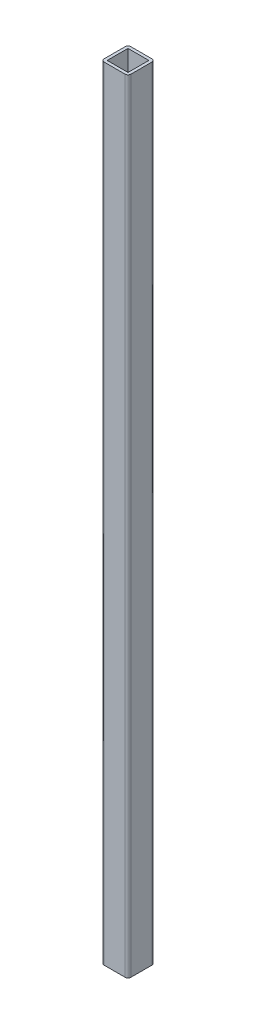
ISO-10303-21;
HEADER;
FILE_DESCRIPTION(('STEP AP214'),'2;1');
FILE_NAME('part.step','',(''),(''),'','','');
FILE_SCHEMA(('AUTOMOTIVE_DESIGN { 1 0 10303 214 1 1 1 1 }'));
ENDSEC;
DATA;
#1=APPLICATION_CONTEXT('core data for automotive mechanical design processes');
#2=APPLICATION_PROTOCOL_DEFINITION('international standard','automotive_design',2000,#1);
#3=PRODUCT_CONTEXT('',#1,'mechanical');
#4=PRODUCT('Part','Part','',(#3));
#5=PRODUCT_RELATED_PRODUCT_CATEGORY('part','',(#4));
#6=PRODUCT_DEFINITION_FORMATION('','',#4);
#7=PRODUCT_DEFINITION_CONTEXT('part definition',#1,'design');
#8=PRODUCT_DEFINITION('design','',#6,#7);
#9=PRODUCT_DEFINITION_SHAPE('','',#8);
#10=(LENGTH_UNIT() NAMED_UNIT(*) SI_UNIT(.MILLI.,.METRE.));
#11=(NAMED_UNIT(*) PLANE_ANGLE_UNIT() SI_UNIT($,.RADIAN.));
#12=(NAMED_UNIT(*) SI_UNIT($,.STERADIAN.) SOLID_ANGLE_UNIT());
#13=UNCERTAINTY_MEASURE_WITH_UNIT(LENGTH_MEASURE(1.E-05),#10,'distance_accuracy_value','');
#14=(GEOMETRIC_REPRESENTATION_CONTEXT(3) GLOBAL_UNCERTAINTY_ASSIGNED_CONTEXT((#13)) GLOBAL_UNIT_ASSIGNED_CONTEXT((#10,
#11,#12)) REPRESENTATION_CONTEXT('',''));
#15=CARTESIAN_POINT('',(0.,0.,0.));
#16=DIRECTION('',(0.,0.,1.));
#17=DIRECTION('',(1.,0.,0.));
#18=AXIS2_PLACEMENT_3D('',#15,#16,#17);
#19=CARTESIAN_POINT('',(22.8,750.2,2.8));
#20=DIRECTION('',(0.,-1.,0.));
#21=DIRECTION('',(0.,0.,-1.));
#22=AXIS2_PLACEMENT_3D('',#19,#20,#21);
#23=CYLINDRICAL_SURFACE('',#22,2.8);
#24=CARTESIAN_POINT('',(22.8,0.,2.8));
#25=DIRECTION('',(0.,1.,0.));
#26=DIRECTION('',(0.,0.,-1.));
#27=AXIS2_PLACEMENT_3D('',#24,#25,#26);
#28=CIRCLE('',#27,2.8);
#29=CARTESIAN_POINT('',(25.6,0.,2.80000000000002));
#30=VERTEX_POINT('',#29);
#31=CARTESIAN_POINT('',(22.8,0.,0.));
#32=VERTEX_POINT('',#31);
#33=EDGE_CURVE('E155',#30,#32,#28,.T.);
#34=ORIENTED_EDGE('',*,*,#33,.T.);
#35=DIRECTION('',(0.,-1.,0.));
#36=VECTOR('',#35,1.);
#37=CARTESIAN_POINT('',(22.8,750.2,0.));
#38=LINE('',#37,#36);
#39=CARTESIAN_POINT('',(22.8,750.2,0.));
#40=VERTEX_POINT('',#39);
#41=EDGE_CURVE('E11',#40,#32,#38,.T.);
#42=ORIENTED_EDGE('',*,*,#41,.F.);
#43=CARTESIAN_POINT('',(22.8,750.2,2.8));
#44=DIRECTION('',(0.,1.,0.));
#45=DIRECTION('',(0.,0.,-1.));
#46=AXIS2_PLACEMENT_3D('',#43,#44,#45);
#47=CIRCLE('',#46,2.8);
#48=CARTESIAN_POINT('',(25.6,750.2,2.80000000000002));
#49=VERTEX_POINT('',#48);
#50=EDGE_CURVE('E159',#49,#40,#47,.T.);
#51=ORIENTED_EDGE('',*,*,#50,.F.);
#52=DIRECTION('',(0.,-1.,0.));
#53=VECTOR('',#52,1.);
#54=CARTESIAN_POINT('',(25.6,750.2,2.80000000000002));
#55=LINE('',#54,#53);
#56=EDGE_CURVE('E177',#49,#30,#55,.T.);
#57=ORIENTED_EDGE('',*,*,#56,.T.);
#58=EDGE_LOOP('',(#34,#42,#51,#57));
#59=FACE_BOUND('',#58,.T.);
#60=ADVANCED_FACE('F34',(#59),#23,.T.);
#61=CARTESIAN_POINT('',(2.80000000000002,750.2,0.));
#62=DIRECTION('',(0.,0.,1.));
#63=DIRECTION('',(1.,0.,0.));
#64=AXIS2_PLACEMENT_3D('',#61,#62,#63);
#65=PLANE('',#64);
#66=DIRECTION('',(-1.,0.,0.));
#67=VECTOR('',#66,1.);
#68=CARTESIAN_POINT('',(2.80000000000002,0.,0.));
#69=LINE('',#68,#67);
#70=CARTESIAN_POINT('',(2.80000000000002,0.,0.));
#71=VERTEX_POINT('',#70);
#72=EDGE_CURVE('E180',#32,#71,#69,.T.);
#73=ORIENTED_EDGE('',*,*,#72,.T.);
#74=DIRECTION('',(0.,-1.,0.));
#75=VECTOR('',#74,1.);
#76=CARTESIAN_POINT('',(2.80000000000002,750.2,0.));
#77=LINE('',#76,#75);
#78=CARTESIAN_POINT('',(2.80000000000002,750.2,0.));
#79=VERTEX_POINT('',#78);
#80=EDGE_CURVE('E41',#79,#71,#77,.T.);
#81=ORIENTED_EDGE('',*,*,#80,.F.);
#82=DIRECTION('',(-1.,0.,0.));
#83=VECTOR('',#82,1.);
#84=CARTESIAN_POINT('',(2.80000000000002,750.2,0.));
#85=LINE('',#84,#83);
#86=EDGE_CURVE('E162',#40,#79,#85,.T.);
#87=ORIENTED_EDGE('',*,*,#86,.F.);
#88=ORIENTED_EDGE('',*,*,#41,.T.);
#89=EDGE_LOOP('',(#73,#81,#87,#88));
#90=FACE_BOUND('',#89,.T.);
#91=ADVANCED_FACE('F235',(#90),#65,.F.);
#92=CARTESIAN_POINT('',(2.8,750.2,2.8));
#93=DIRECTION('',(0.,-1.,0.));
#94=DIRECTION('',(0.,0.,-1.));
#95=AXIS2_PLACEMENT_3D('',#92,#93,#94);
#96=CYLINDRICAL_SURFACE('',#95,2.8);
#97=CARTESIAN_POINT('',(2.8,0.,2.8));
#98=DIRECTION('',(0.,1.,0.));
#99=DIRECTION('',(0.,0.,1.));
#100=AXIS2_PLACEMENT_3D('',#97,#98,#99);
#101=CIRCLE('',#100,2.8);
#102=CARTESIAN_POINT('',(0.,0.,2.80000000000002));
#103=VERTEX_POINT('',#102);
#104=EDGE_CURVE('E182',#71,#103,#101,.T.);
#105=ORIENTED_EDGE('',*,*,#104,.T.);
#106=DIRECTION('',(0.,-1.,0.));
#107=VECTOR('',#106,1.);
#108=CARTESIAN_POINT('',(0.,750.2,2.80000000000002));
#109=LINE('',#108,#107);
#110=CARTESIAN_POINT('',(0.,750.2,2.80000000000002));
#111=VERTEX_POINT('',#110);
#112=EDGE_CURVE('E207',#111,#103,#109,.T.);
#113=ORIENTED_EDGE('',*,*,#112,.F.);
#114=CARTESIAN_POINT('',(2.8,750.2,2.8));
#115=DIRECTION('',(0.,1.,0.));
#116=DIRECTION('',(0.,0.,1.));
#117=AXIS2_PLACEMENT_3D('',#114,#115,#116);
#118=CIRCLE('',#117,2.8);
#119=EDGE_CURVE('E165',#79,#111,#118,.T.);
#120=ORIENTED_EDGE('',*,*,#119,.F.);
#121=ORIENTED_EDGE('',*,*,#80,.T.);
#122=EDGE_LOOP('',(#105,#113,#120,#121));
#123=FACE_BOUND('',#122,.T.);
#124=ADVANCED_FACE('F214',(#123),#96,.T.);
#125=CARTESIAN_POINT('',(0.,750.2,2.80000000000002));
#126=DIRECTION('',(1.,0.,0.));
#127=DIRECTION('',(0.,0.,-1.));
#128=AXIS2_PLACEMENT_3D('',#125,#126,#127);
#129=PLANE('',#128);
#130=DIRECTION('',(0.,0.,1.));
#131=VECTOR('',#130,1.);
#132=CARTESIAN_POINT('',(0.,0.,2.80000000000002));
#133=LINE('',#132,#131);
#134=CARTESIAN_POINT('',(0.,0.,22.8));
#135=VERTEX_POINT('',#134);
#136=EDGE_CURVE('E184',#103,#135,#133,.T.);
#137=ORIENTED_EDGE('',*,*,#136,.T.);
#138=DIRECTION('',(0.,-1.,0.));
#139=VECTOR('',#138,1.);
#140=CARTESIAN_POINT('',(0.,750.2,22.8));
#141=LINE('',#140,#139);
#142=CARTESIAN_POINT('',(0.,750.2,22.8));
#143=VERTEX_POINT('',#142);
#144=EDGE_CURVE('E204',#143,#135,#141,.T.);
#145=ORIENTED_EDGE('',*,*,#144,.F.);
#146=DIRECTION('',(0.,0.,1.));
#147=VECTOR('',#146,1.);
#148=CARTESIAN_POINT('',(0.,750.2,2.80000000000002));
#149=LINE('',#148,#147);
#150=EDGE_CURVE('E167',#111,#143,#149,.T.);
#151=ORIENTED_EDGE('',*,*,#150,.F.);
#152=ORIENTED_EDGE('',*,*,#112,.T.);
#153=EDGE_LOOP('',(#137,#145,#151,#152));
#154=FACE_BOUND('',#153,.T.);
#155=ADVANCED_FACE('F225',(#154),#129,.F.);
#156=CARTESIAN_POINT('',(2.8,750.2,22.8));
#157=DIRECTION('',(0.,-1.,0.));
#158=DIRECTION('',(0.,0.,-1.));
#159=AXIS2_PLACEMENT_3D('',#156,#157,#158);
#160=CYLINDRICAL_SURFACE('',#159,2.8);
#161=CARTESIAN_POINT('',(2.8,0.,22.8));
#162=DIRECTION('',(0.,1.,0.));
#163=DIRECTION('',(0.,0.,1.));
#164=AXIS2_PLACEMENT_3D('',#161,#162,#163);
#165=CIRCLE('',#164,2.8);
#166=CARTESIAN_POINT('',(2.80000000000002,0.,25.6));
#167=VERTEX_POINT('',#166);
#168=EDGE_CURVE('E186',#135,#167,#165,.T.);
#169=ORIENTED_EDGE('',*,*,#168,.T.);
#170=DIRECTION('',(0.,-1.,0.));
#171=VECTOR('',#170,1.);
#172=CARTESIAN_POINT('',(2.80000000000002,750.2,25.6));
#173=LINE('',#172,#171);
#174=CARTESIAN_POINT('',(2.80000000000002,750.2,25.6));
#175=VERTEX_POINT('',#174);
#176=EDGE_CURVE('E201',#175,#167,#173,.T.);
#177=ORIENTED_EDGE('',*,*,#176,.F.);
#178=CARTESIAN_POINT('',(2.8,750.2,22.8));
#179=DIRECTION('',(0.,1.,0.));
#180=DIRECTION('',(0.,0.,1.));
#181=AXIS2_PLACEMENT_3D('',#178,#179,#180);
#182=CIRCLE('',#181,2.8);
#183=EDGE_CURVE('E169',#143,#175,#182,.T.);
#184=ORIENTED_EDGE('',*,*,#183,.F.);
#185=ORIENTED_EDGE('',*,*,#144,.T.);
#186=EDGE_LOOP('',(#169,#177,#184,#185));
#187=FACE_BOUND('',#186,.T.);
#188=ADVANCED_FACE('F229',(#187),#160,.T.);
#189=CARTESIAN_POINT('',(2.80000000000002,750.2,25.6));
#190=DIRECTION('',(0.,0.,-1.));
#191=DIRECTION('',(-1.,0.,0.));
#192=AXIS2_PLACEMENT_3D('',#189,#190,#191);
#193=PLANE('',#192);
#194=DIRECTION('',(1.,0.,0.));
#195=VECTOR('',#194,1.);
#196=CARTESIAN_POINT('',(2.80000000000002,0.,25.6));
#197=LINE('',#196,#195);
#198=CARTESIAN_POINT('',(22.8,0.,25.6));
#199=VERTEX_POINT('',#198);
#200=EDGE_CURVE('E188',#167,#199,#197,.T.);
#201=ORIENTED_EDGE('',*,*,#200,.T.);
#202=DIRECTION('',(0.,-1.,0.));
#203=VECTOR('',#202,1.);
#204=CARTESIAN_POINT('',(22.8,750.2,25.6));
#205=LINE('',#204,#203);
#206=CARTESIAN_POINT('',(22.8,750.2,25.6));
#207=VERTEX_POINT('',#206);
#208=EDGE_CURVE('E198',#207,#199,#205,.T.);
#209=ORIENTED_EDGE('',*,*,#208,.F.);
#210=DIRECTION('',(1.,0.,0.));
#211=VECTOR('',#210,1.);
#212=CARTESIAN_POINT('',(2.80000000000002,750.2,25.6));
#213=LINE('',#212,#211);
#214=EDGE_CURVE('E171',#175,#207,#213,.T.);
#215=ORIENTED_EDGE('',*,*,#214,.F.);
#216=ORIENTED_EDGE('',*,*,#176,.T.);
#217=EDGE_LOOP('',(#201,#209,#215,#216));
#218=FACE_BOUND('',#217,.T.);
#219=ADVANCED_FACE('F248',(#218),#193,.F.);
#220=CARTESIAN_POINT('',(22.8,750.2,22.8));
#221=DIRECTION('',(0.,-1.,0.));
#222=DIRECTION('',(0.,0.,-1.));
#223=AXIS2_PLACEMENT_3D('',#220,#221,#222);
#224=CYLINDRICAL_SURFACE('',#223,2.8);
#225=CARTESIAN_POINT('',(22.8,0.,22.8));
#226=DIRECTION('',(0.,1.,0.));
#227=DIRECTION('',(0.,0.,1.));
#228=AXIS2_PLACEMENT_3D('',#225,#226,#227);
#229=CIRCLE('',#228,2.8);
#230=CARTESIAN_POINT('',(25.6,0.,22.8));
#231=VERTEX_POINT('',#230);
#232=EDGE_CURVE('E190',#199,#231,#229,.T.);
#233=ORIENTED_EDGE('',*,*,#232,.T.);
#234=DIRECTION('',(0.,-1.,0.));
#235=VECTOR('',#234,1.);
#236=CARTESIAN_POINT('',(25.6,750.2,22.8));
#237=LINE('',#236,#235);
#238=CARTESIAN_POINT('',(25.6,750.2,22.8));
#239=VERTEX_POINT('',#238);
#240=EDGE_CURVE('E195',#239,#231,#237,.T.);
#241=ORIENTED_EDGE('',*,*,#240,.F.);
#242=CARTESIAN_POINT('',(22.8,750.2,22.8));
#243=DIRECTION('',(0.,1.,0.));
#244=DIRECTION('',(0.,0.,1.));
#245=AXIS2_PLACEMENT_3D('',#242,#243,#244);
#246=CIRCLE('',#245,2.8);
#247=EDGE_CURVE('E173',#207,#239,#246,.T.);
#248=ORIENTED_EDGE('',*,*,#247,.F.);
#249=ORIENTED_EDGE('',*,*,#208,.T.);
#250=EDGE_LOOP('',(#233,#241,#248,#249));
#251=FACE_BOUND('',#250,.T.);
#252=ADVANCED_FACE('F246',(#251),#224,.T.);
#253=CARTESIAN_POINT('',(25.6,750.2,2.80000000000002));
#254=DIRECTION('',(-1.,0.,0.));
#255=DIRECTION('',(0.,0.,1.));
#256=AXIS2_PLACEMENT_3D('',#253,#254,#255);
#257=PLANE('',#256);
#258=DIRECTION('',(0.,0.,-1.));
#259=VECTOR('',#258,1.);
#260=CARTESIAN_POINT('',(25.6,0.,2.80000000000002));
#261=LINE('',#260,#259);
#262=EDGE_CURVE('E163',#231,#30,#261,.T.);
#263=ORIENTED_EDGE('',*,*,#262,.T.);
#264=ORIENTED_EDGE('',*,*,#56,.F.);
#265=DIRECTION('',(0.,0.,-1.));
#266=VECTOR('',#265,1.);
#267=CARTESIAN_POINT('',(25.6,750.2,2.80000000000002));
#268=LINE('',#267,#266);
#269=EDGE_CURVE('E175',#239,#49,#268,.T.);
#270=ORIENTED_EDGE('',*,*,#269,.F.);
#271=ORIENTED_EDGE('',*,*,#240,.T.);
#272=EDGE_LOOP('',(#263,#264,#270,#271));
#273=FACE_BOUND('',#272,.T.);
#274=ADVANCED_FACE('F241',(#273),#257,.F.);
#275=CARTESIAN_POINT('',(22.8,750.2,2.8));
#276=DIRECTION('',(0.,-1.,0.));
#277=DIRECTION('',(0.,0.,-1.));
#278=AXIS2_PLACEMENT_3D('',#275,#276,#277);
#279=PLANE('',#278);
#280=DIRECTION('',(1.,0.,0.));
#281=VECTOR('',#280,1.);
#282=CARTESIAN_POINT('',(2.8,750.2,2.8));
#283=LINE('',#282,#281);
#284=CARTESIAN_POINT('',(2.8,750.2,2.8));
#285=VERTEX_POINT('',#284);
#286=CARTESIAN_POINT('',(22.8,750.2,2.8));
#287=VERTEX_POINT('',#286);
#288=EDGE_CURVE('E130',#285,#287,#283,.T.);
#289=ORIENTED_EDGE('',*,*,#288,.T.);
#290=DIRECTION('',(0.,0.,1.));
#291=VECTOR('',#290,1.);
#292=CARTESIAN_POINT('',(22.8,750.2,2.8));
#293=LINE('',#292,#291);
#294=CARTESIAN_POINT('',(22.8,750.2,22.8));
#295=VERTEX_POINT('',#294);
#296=EDGE_CURVE('E124',#287,#295,#293,.T.);
#297=ORIENTED_EDGE('',*,*,#296,.T.);
#298=DIRECTION('',(-1.,0.,0.));
#299=VECTOR('',#298,1.);
#300=CARTESIAN_POINT('',(2.8,750.2,22.8));
#301=LINE('',#300,#299);
#302=CARTESIAN_POINT('',(2.8,750.2,22.8));
#303=VERTEX_POINT('',#302);
#304=EDGE_CURVE('E133',#295,#303,#301,.T.);
#305=ORIENTED_EDGE('',*,*,#304,.T.);
#306=DIRECTION('',(0.,0.,-1.));
#307=VECTOR('',#306,1.);
#308=CARTESIAN_POINT('',(2.8,750.2,2.8));
#309=LINE('',#308,#307);
#310=EDGE_CURVE('E48',#303,#285,#309,.T.);
#311=ORIENTED_EDGE('',*,*,#310,.T.);
#312=EDGE_LOOP('',(#289,#297,#305,#311));
#313=FACE_BOUND('',#312,.T.);
#314=ORIENTED_EDGE('',*,*,#50,.T.);
#315=ORIENTED_EDGE('',*,*,#86,.T.);
#316=ORIENTED_EDGE('',*,*,#119,.T.);
#317=ORIENTED_EDGE('',*,*,#150,.T.);
#318=ORIENTED_EDGE('',*,*,#183,.T.);
#319=ORIENTED_EDGE('',*,*,#214,.T.);
#320=ORIENTED_EDGE('',*,*,#247,.T.);
#321=ORIENTED_EDGE('',*,*,#269,.T.);
#322=EDGE_LOOP('',(#314,#315,#316,#317,#318,#319,#320,#321));
#323=FACE_BOUND('',#322,.T.);
#324=ADVANCED_FACE('F137',(#313,#323),#279,.F.);
#325=CARTESIAN_POINT('',(22.8,0.,2.8));
#326=DIRECTION('',(0.,-1.,0.));
#327=DIRECTION('',(0.,0.,-1.));
#328=AXIS2_PLACEMENT_3D('',#325,#326,#327);
#329=PLANE('',#328);
#330=DIRECTION('',(0.,0.,1.));
#331=VECTOR('',#330,1.);
#332=CARTESIAN_POINT('',(22.8,0.,2.8));
#333=LINE('',#332,#331);
#334=CARTESIAN_POINT('',(22.8,0.,2.8));
#335=VERTEX_POINT('',#334);
#336=CARTESIAN_POINT('',(22.8,0.,22.8));
#337=VERTEX_POINT('',#336);
#338=EDGE_CURVE('E56',#335,#337,#333,.T.);
#339=ORIENTED_EDGE('',*,*,#338,.F.);
#340=DIRECTION('',(1.,0.,0.));
#341=VECTOR('',#340,1.);
#342=CARTESIAN_POINT('',(2.8,0.,2.8));
#343=LINE('',#342,#341);
#344=CARTESIAN_POINT('',(2.8,0.,2.8));
#345=VERTEX_POINT('',#344);
#346=EDGE_CURVE('E140',#345,#335,#343,.T.);
#347=ORIENTED_EDGE('',*,*,#346,.F.);
#348=DIRECTION('',(0.,0.,-1.));
#349=VECTOR('',#348,1.);
#350=CARTESIAN_POINT('',(2.8,0.,2.8));
#351=LINE('',#350,#349);
#352=CARTESIAN_POINT('',(2.8,0.,22.8));
#353=VERTEX_POINT('',#352);
#354=EDGE_CURVE('E143',#353,#345,#351,.T.);
#355=ORIENTED_EDGE('',*,*,#354,.F.);
#356=DIRECTION('',(-1.,0.,0.));
#357=VECTOR('',#356,1.);
#358=CARTESIAN_POINT('',(2.8,0.,22.8));
#359=LINE('',#358,#357);
#360=EDGE_CURVE('E149',#337,#353,#359,.T.);
#361=ORIENTED_EDGE('',*,*,#360,.F.);
#362=EDGE_LOOP('',(#339,#347,#355,#361));
#363=FACE_BOUND('',#362,.T.);
#364=ORIENTED_EDGE('',*,*,#33,.F.);
#365=ORIENTED_EDGE('',*,*,#262,.F.);
#366=ORIENTED_EDGE('',*,*,#232,.F.);
#367=ORIENTED_EDGE('',*,*,#200,.F.);
#368=ORIENTED_EDGE('',*,*,#168,.F.);
#369=ORIENTED_EDGE('',*,*,#136,.F.);
#370=ORIENTED_EDGE('',*,*,#104,.F.);
#371=ORIENTED_EDGE('',*,*,#72,.F.);
#372=EDGE_LOOP('',(#364,#365,#366,#367,#368,#369,#370,#371));
#373=FACE_BOUND('',#372,.T.);
#374=ADVANCED_FACE('F220',(#363,#373),#329,.T.);
#375=CARTESIAN_POINT('',(22.8,750.2,2.8));
#376=DIRECTION('',(1.,0.,0.));
#377=DIRECTION('',(0.,0.,-1.));
#378=AXIS2_PLACEMENT_3D('',#375,#376,#377);
#379=PLANE('',#378);
#380=ORIENTED_EDGE('',*,*,#338,.T.);
#381=DIRECTION('',(0.,-1.,0.));
#382=VECTOR('',#381,1.);
#383=CARTESIAN_POINT('',(22.8,750.2,22.8));
#384=LINE('',#383,#382);
#385=EDGE_CURVE('E120',#295,#337,#384,.T.);
#386=ORIENTED_EDGE('',*,*,#385,.F.);
#387=ORIENTED_EDGE('',*,*,#296,.F.);
#388=DIRECTION('',(0.,-1.,0.));
#389=VECTOR('',#388,1.);
#390=CARTESIAN_POINT('',(22.8,750.2,2.8));
#391=LINE('',#390,#389);
#392=EDGE_CURVE('E153',#287,#335,#391,.T.);
#393=ORIENTED_EDGE('',*,*,#392,.T.);
#394=EDGE_LOOP('',(#380,#386,#387,#393));
#395=FACE_BOUND('',#394,.T.);
#396=ADVANCED_FACE('F122',(#395),#379,.F.);
#397=CARTESIAN_POINT('',(2.8,750.2,2.8));
#398=DIRECTION('',(0.,0.,-1.));
#399=DIRECTION('',(-1.,0.,0.));
#400=AXIS2_PLACEMENT_3D('',#397,#398,#399);
#401=PLANE('',#400);
#402=ORIENTED_EDGE('',*,*,#346,.T.);
#403=ORIENTED_EDGE('',*,*,#392,.F.);
#404=ORIENTED_EDGE('',*,*,#288,.F.);
#405=DIRECTION('',(0.,-1.,0.));
#406=VECTOR('',#405,1.);
#407=CARTESIAN_POINT('',(2.8,750.2,2.8));
#408=LINE('',#407,#406);
#409=EDGE_CURVE('E156',#285,#345,#408,.T.);
#410=ORIENTED_EDGE('',*,*,#409,.T.);
#411=EDGE_LOOP('',(#402,#403,#404,#410));
#412=FACE_BOUND('',#411,.T.);
#413=ADVANCED_FACE('F319',(#412),#401,.F.);
#414=CARTESIAN_POINT('',(2.8,750.2,2.8));
#415=DIRECTION('',(-1.,0.,0.));
#416=DIRECTION('',(0.,0.,1.));
#417=AXIS2_PLACEMENT_3D('',#414,#415,#416);
#418=PLANE('',#417);
#419=ORIENTED_EDGE('',*,*,#354,.T.);
#420=ORIENTED_EDGE('',*,*,#409,.F.);
#421=ORIENTED_EDGE('',*,*,#310,.F.);
#422=DIRECTION('',(0.,-1.,0.));
#423=VECTOR('',#422,1.);
#424=CARTESIAN_POINT('',(2.8,750.2,22.8));
#425=LINE('',#424,#423);
#426=EDGE_CURVE('E129',#303,#353,#425,.T.);
#427=ORIENTED_EDGE('',*,*,#426,.T.);
#428=EDGE_LOOP('',(#419,#420,#421,#427));
#429=FACE_BOUND('',#428,.T.);
#430=ADVANCED_FACE('F328',(#429),#418,.F.);
#431=CARTESIAN_POINT('',(2.8,750.2,22.8));
#432=DIRECTION('',(0.,0.,1.));
#433=DIRECTION('',(1.,0.,0.));
#434=AXIS2_PLACEMENT_3D('',#431,#432,#433);
#435=PLANE('',#434);
#436=ORIENTED_EDGE('',*,*,#360,.T.);
#437=ORIENTED_EDGE('',*,*,#426,.F.);
#438=ORIENTED_EDGE('',*,*,#304,.F.);
#439=ORIENTED_EDGE('',*,*,#385,.T.);
#440=EDGE_LOOP('',(#436,#437,#438,#439));
#441=FACE_BOUND('',#440,.T.);
#442=ADVANCED_FACE('F134',(#441),#435,.F.);
#443=CLOSED_SHELL('',(#60,#91,#124,#155,#188,#219,#252,#274,#324,#374,#396,#413,#430,#442));
#444=MANIFOLD_SOLID_BREP('B2',#443);
#445=ADVANCED_BREP_SHAPE_REPRESENTATION('',(#18,#444),#14);
#446=SHAPE_DEFINITION_REPRESENTATION(#9,#445);
ENDSEC;
END-ISO-10303-21;
